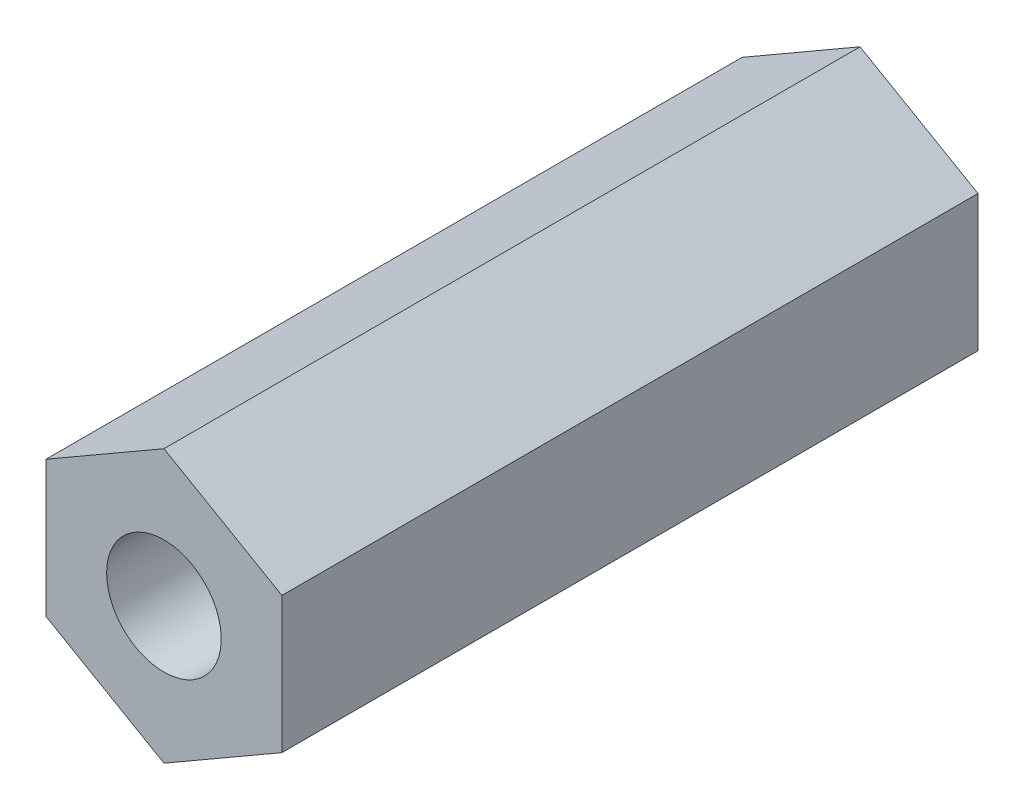
ISO-10303-21;
HEADER;
FILE_DESCRIPTION(('STEP AP214'),'2;1');
FILE_NAME('part.step','',(''),(''),'','','');
FILE_SCHEMA(('AUTOMOTIVE_DESIGN { 1 0 10303 214 1 1 1 1 }'));
ENDSEC;
DATA;
#1=APPLICATION_CONTEXT('core data for automotive mechanical design processes');
#2=APPLICATION_PROTOCOL_DEFINITION('international standard','automotive_design',2000,#1);
#3=PRODUCT_CONTEXT('',#1,'mechanical');
#4=PRODUCT('Part','Part','',(#3));
#5=PRODUCT_RELATED_PRODUCT_CATEGORY('part','',(#4));
#6=PRODUCT_DEFINITION_FORMATION('','',#4);
#7=PRODUCT_DEFINITION_CONTEXT('part definition',#1,'design');
#8=PRODUCT_DEFINITION('design','',#6,#7);
#9=PRODUCT_DEFINITION_SHAPE('','',#8);
#10=(LENGTH_UNIT() NAMED_UNIT(*) SI_UNIT(.MILLI.,.METRE.));
#11=(NAMED_UNIT(*) PLANE_ANGLE_UNIT() SI_UNIT($,.RADIAN.));
#12=(NAMED_UNIT(*) SI_UNIT($,.STERADIAN.) SOLID_ANGLE_UNIT());
#13=UNCERTAINTY_MEASURE_WITH_UNIT(LENGTH_MEASURE(1.E-05),#10,'distance_accuracy_value','');
#14=(GEOMETRIC_REPRESENTATION_CONTEXT(3) GLOBAL_UNCERTAINTY_ASSIGNED_CONTEXT((#13)) GLOBAL_UNIT_ASSIGNED_CONTEXT((#10,
#11,#12)) REPRESENTATION_CONTEXT('',''));
#15=CARTESIAN_POINT('',(0.,0.,0.));
#16=DIRECTION('',(0.,0.,1.));
#17=DIRECTION('',(1.,0.,0.));
#18=AXIS2_PLACEMENT_3D('',#15,#16,#17);
#19=CARTESIAN_POINT('',(39.4987426312891,33.98,63.5));
#20=DIRECTION('',(-1.,0.,0.));
#21=DIRECTION('',(0.,0.,1.));
#22=AXIS2_PLACEMENT_3D('',#19,#20,#21);
#23=PLANE('',#22);
#24=DIRECTION('',(0.,1.,0.));
#25=VECTOR('',#24,1.);
#26=CARTESIAN_POINT('',(39.4987426312891,33.98,42.85));
#27=LINE('',#26,#25);
#28=CARTESIAN_POINT('',(39.4987426312891,33.98,42.85));
#29=VERTEX_POINT('',#28);
#30=CARTESIAN_POINT('',(39.4987426312891,38.02,42.85));
#31=VERTEX_POINT('',#30);
#32=EDGE_CURVE('E135',#29,#31,#27,.T.);
#33=ORIENTED_EDGE('',*,*,#32,.T.);
#34=DIRECTION('',(0.,0.,-1.));
#35=VECTOR('',#34,1.);
#36=CARTESIAN_POINT('',(39.4987426312891,38.02,63.5));
#37=LINE('',#36,#35);
#38=CARTESIAN_POINT('',(39.4987426312891,38.02,63.5));
#39=VERTEX_POINT('',#38);
#40=EDGE_CURVE('E11',#39,#31,#37,.T.);
#41=ORIENTED_EDGE('',*,*,#40,.F.);
#42=DIRECTION('',(0.,1.,0.));
#43=VECTOR('',#42,1.);
#44=CARTESIAN_POINT('',(39.4987426312891,33.98,63.5));
#45=LINE('',#44,#43);
#46=CARTESIAN_POINT('',(39.4987426312891,33.98,63.5));
#47=VERTEX_POINT('',#46);
#48=EDGE_CURVE('E151',#47,#39,#45,.T.);
#49=ORIENTED_EDGE('',*,*,#48,.F.);
#50=DIRECTION('',(0.,0.,-1.));
#51=VECTOR('',#50,1.);
#52=CARTESIAN_POINT('',(39.4987426312891,33.98,63.5));
#53=LINE('',#52,#51);
#54=EDGE_CURVE('E128',#47,#29,#53,.T.);
#55=ORIENTED_EDGE('',*,*,#54,.T.);
#56=EDGE_LOOP('',(#33,#41,#49,#55));
#57=FACE_BOUND('',#56,.T.);
#58=ADVANCED_FACE('F44',(#57),#23,.F.);
#59=CARTESIAN_POINT('',(39.4987426312891,38.02,63.5));
#60=DIRECTION('',(-0.5,-0.866025403784438,0.));
#61=DIRECTION('',(0.866025403784439,-0.5,0.));
#62=AXIS2_PLACEMENT_3D('',#59,#60,#61);
#63=PLANE('',#62);
#64=DIRECTION('',(-0.866025403784439,0.5,0.));
#65=VECTOR('',#64,1.);
#66=CARTESIAN_POINT('',(39.4987426312891,38.02,42.85));
#67=LINE('',#66,#65);
#68=CARTESIAN_POINT('',(36.,40.04,42.85));
#69=VERTEX_POINT('',#68);
#70=EDGE_CURVE('E136',#31,#69,#67,.T.);
#71=ORIENTED_EDGE('',*,*,#70,.T.);
#72=DIRECTION('',(0.,0.,-1.));
#73=VECTOR('',#72,1.);
#74=CARTESIAN_POINT('',(36.,40.04,63.5));
#75=LINE('',#74,#73);
#76=CARTESIAN_POINT('',(36.,40.04,63.5));
#77=VERTEX_POINT('',#76);
#78=EDGE_CURVE('E53',#77,#69,#75,.T.);
#79=ORIENTED_EDGE('',*,*,#78,.F.);
#80=DIRECTION('',(-0.866025403784439,0.5,0.));
#81=VECTOR('',#80,1.);
#82=CARTESIAN_POINT('',(39.4987426312891,38.02,63.5));
#83=LINE('',#82,#81);
#84=EDGE_CURVE('E97',#39,#77,#83,.T.);
#85=ORIENTED_EDGE('',*,*,#84,.F.);
#86=ORIENTED_EDGE('',*,*,#40,.T.);
#87=EDGE_LOOP('',(#71,#79,#85,#86));
#88=FACE_BOUND('',#87,.T.);
#89=ADVANCED_FACE('F177',(#88),#63,.F.);
#90=CARTESIAN_POINT('',(36.,40.04,63.5));
#91=DIRECTION('',(0.5,-0.866025403784439,0.));
#92=DIRECTION('',(0.866025403784439,0.5,0.));
#93=AXIS2_PLACEMENT_3D('',#90,#91,#92);
#94=PLANE('',#93);
#95=DIRECTION('',(-0.866025403784439,-0.5,0.));
#96=VECTOR('',#95,1.);
#97=CARTESIAN_POINT('',(36.,40.04,42.85));
#98=LINE('',#97,#96);
#99=CARTESIAN_POINT('',(32.5012573687109,38.02,42.85));
#100=VERTEX_POINT('',#99);
#101=EDGE_CURVE('E142',#69,#100,#98,.T.);
#102=ORIENTED_EDGE('',*,*,#101,.T.);
#103=DIRECTION('',(0.,0.,-1.));
#104=VECTOR('',#103,1.);
#105=CARTESIAN_POINT('',(32.5012573687109,38.02,63.5));
#106=LINE('',#105,#104);
#107=CARTESIAN_POINT('',(32.5012573687109,38.02,63.5));
#108=VERTEX_POINT('',#107);
#109=EDGE_CURVE('E121',#108,#100,#106,.T.);
#110=ORIENTED_EDGE('',*,*,#109,.F.);
#111=DIRECTION('',(-0.866025403784439,-0.5,0.));
#112=VECTOR('',#111,1.);
#113=CARTESIAN_POINT('',(36.,40.04,63.5));
#114=LINE('',#113,#112);
#115=EDGE_CURVE('E115',#77,#108,#114,.T.);
#116=ORIENTED_EDGE('',*,*,#115,.F.);
#117=ORIENTED_EDGE('',*,*,#78,.T.);
#118=EDGE_LOOP('',(#102,#110,#116,#117));
#119=FACE_BOUND('',#118,.T.);
#120=ADVANCED_FACE('F161',(#119),#94,.F.);
#121=CARTESIAN_POINT('',(32.5012573687109,38.02,63.5));
#122=DIRECTION('',(1.,0.,0.));
#123=DIRECTION('',(0.,0.,-1.));
#124=AXIS2_PLACEMENT_3D('',#121,#122,#123);
#125=PLANE('',#124);
#126=DIRECTION('',(0.,-1.,0.));
#127=VECTOR('',#126,1.);
#128=CARTESIAN_POINT('',(32.5012573687109,38.02,42.85));
#129=LINE('',#128,#127);
#130=CARTESIAN_POINT('',(32.5012573687109,33.98,42.85));
#131=VERTEX_POINT('',#130);
#132=EDGE_CURVE('E123',#100,#131,#129,.T.);
#133=ORIENTED_EDGE('',*,*,#132,.T.);
#134=DIRECTION('',(0.,0.,-1.));
#135=VECTOR('',#134,1.);
#136=CARTESIAN_POINT('',(32.5012573687109,33.98,63.5));
#137=LINE('',#136,#135);
#138=CARTESIAN_POINT('',(32.5012573687109,33.98,63.5));
#139=VERTEX_POINT('',#138);
#140=EDGE_CURVE('E117',#139,#131,#137,.T.);
#141=ORIENTED_EDGE('',*,*,#140,.F.);
#142=DIRECTION('',(0.,-1.,0.));
#143=VECTOR('',#142,1.);
#144=CARTESIAN_POINT('',(32.5012573687109,38.02,63.5));
#145=LINE('',#144,#143);
#146=EDGE_CURVE('E106',#108,#139,#145,.T.);
#147=ORIENTED_EDGE('',*,*,#146,.F.);
#148=ORIENTED_EDGE('',*,*,#109,.T.);
#149=EDGE_LOOP('',(#133,#141,#147,#148));
#150=FACE_BOUND('',#149,.T.);
#151=ADVANCED_FACE('F120',(#150),#125,.F.);
#152=CARTESIAN_POINT('',(32.5012573687109,33.98,63.5));
#153=DIRECTION('',(0.499999999999998,0.86602540378444,0.));
#154=DIRECTION('',(-0.86602540378444,0.499999999999998,0.));
#155=AXIS2_PLACEMENT_3D('',#152,#153,#154);
#156=PLANE('',#155);
#157=DIRECTION('',(0.86602540378444,-0.499999999999998,0.));
#158=VECTOR('',#157,1.);
#159=CARTESIAN_POINT('',(32.5012573687109,33.98,42.85));
#160=LINE('',#159,#158);
#161=CARTESIAN_POINT('',(36.,31.96,42.85));
#162=VERTEX_POINT('',#161);
#163=EDGE_CURVE('E82',#131,#162,#160,.T.);
#164=ORIENTED_EDGE('',*,*,#163,.T.);
#165=DIRECTION('',(0.,0.,-1.));
#166=VECTOR('',#165,1.);
#167=CARTESIAN_POINT('',(36.,31.96,63.5));
#168=LINE('',#167,#166);
#169=CARTESIAN_POINT('',(36.,31.96,63.5));
#170=VERTEX_POINT('',#169);
#171=EDGE_CURVE('E124',#170,#162,#168,.T.);
#172=ORIENTED_EDGE('',*,*,#171,.F.);
#173=DIRECTION('',(0.86602540378444,-0.499999999999998,0.));
#174=VECTOR('',#173,1.);
#175=CARTESIAN_POINT('',(32.5012573687109,33.98,63.5));
#176=LINE('',#175,#174);
#177=EDGE_CURVE('E109',#139,#170,#176,.T.);
#178=ORIENTED_EDGE('',*,*,#177,.F.);
#179=ORIENTED_EDGE('',*,*,#140,.T.);
#180=EDGE_LOOP('',(#164,#172,#178,#179));
#181=FACE_BOUND('',#180,.T.);
#182=ADVANCED_FACE('F127',(#181),#156,.F.);
#183=CARTESIAN_POINT('',(36.,31.96,63.5));
#184=DIRECTION('',(-0.499999999999999,0.866025403784439,0.));
#185=DIRECTION('',(-0.866025403784439,-0.499999999999999,0.));
#186=AXIS2_PLACEMENT_3D('',#183,#184,#185);
#187=PLANE('',#186);
#188=DIRECTION('',(0.866025403784439,0.499999999999999,0.));
#189=VECTOR('',#188,1.);
#190=CARTESIAN_POINT('',(36.,31.96,42.85));
#191=LINE('',#190,#189);
#192=EDGE_CURVE('E93',#162,#29,#191,.T.);
#193=ORIENTED_EDGE('',*,*,#192,.T.);
#194=ORIENTED_EDGE('',*,*,#54,.F.);
#195=DIRECTION('',(0.866025403784439,0.499999999999999,0.));
#196=VECTOR('',#195,1.);
#197=CARTESIAN_POINT('',(36.,31.96,63.5));
#198=LINE('',#197,#196);
#199=EDGE_CURVE('E64',#170,#47,#198,.T.);
#200=ORIENTED_EDGE('',*,*,#199,.F.);
#201=ORIENTED_EDGE('',*,*,#171,.T.);
#202=EDGE_LOOP('',(#193,#194,#200,#201));
#203=FACE_BOUND('',#202,.T.);
#204=ADVANCED_FACE('F169',(#203),#187,.F.);
#205=CARTESIAN_POINT('',(0.,0.,63.5));
#206=DIRECTION('',(0.,0.,1.));
#207=DIRECTION('',(1.,0.,0.));
#208=AXIS2_PLACEMENT_3D('',#205,#206,#207);
#209=PLANE('',#208);
#210=CARTESIAN_POINT('',(36.,36.,63.5));
#211=DIRECTION('',(0.,0.,1.));
#212=DIRECTION('',(1.,0.,0.));
#213=AXIS2_PLACEMENT_3D('',#210,#211,#212);
#214=CIRCLE('',#213,1.7);
#215=CARTESIAN_POINT('',(34.3,36.,63.5));
#216=VERTEX_POINT('',#215);
#217=EDGE_CURVE('E139',#216,#216,#214,.T.);
#218=ORIENTED_EDGE('',*,*,#217,.F.);
#219=EDGE_LOOP('',(#218));
#220=FACE_BOUND('',#219,.T.);
#221=ORIENTED_EDGE('',*,*,#48,.T.);
#222=ORIENTED_EDGE('',*,*,#84,.T.);
#223=ORIENTED_EDGE('',*,*,#115,.T.);
#224=ORIENTED_EDGE('',*,*,#146,.T.);
#225=ORIENTED_EDGE('',*,*,#177,.T.);
#226=ORIENTED_EDGE('',*,*,#199,.T.);
#227=EDGE_LOOP('',(#221,#222,#223,#224,#225,#226));
#228=FACE_BOUND('',#227,.T.);
#229=ADVANCED_FACE('F107',(#220,#228),#209,.T.);
#230=CARTESIAN_POINT('',(0.,0.,42.85));
#231=DIRECTION('',(0.,0.,1.));
#232=DIRECTION('',(1.,0.,0.));
#233=AXIS2_PLACEMENT_3D('',#230,#231,#232);
#234=PLANE('',#233);
#235=CARTESIAN_POINT('',(36.,36.,42.85));
#236=DIRECTION('',(0.,0.,1.));
#237=DIRECTION('',(1.,0.,0.));
#238=AXIS2_PLACEMENT_3D('',#235,#236,#237);
#239=CIRCLE('',#238,1.7);
#240=CARTESIAN_POINT('',(34.3,36.,42.85));
#241=VERTEX_POINT('',#240);
#242=EDGE_CURVE('E237',#241,#241,#239,.T.);
#243=ORIENTED_EDGE('',*,*,#242,.T.);
#244=EDGE_LOOP('',(#243));
#245=FACE_BOUND('',#244,.T.);
#246=ORIENTED_EDGE('',*,*,#32,.F.);
#247=ORIENTED_EDGE('',*,*,#192,.F.);
#248=ORIENTED_EDGE('',*,*,#163,.F.);
#249=ORIENTED_EDGE('',*,*,#132,.F.);
#250=ORIENTED_EDGE('',*,*,#101,.F.);
#251=ORIENTED_EDGE('',*,*,#70,.F.);
#252=EDGE_LOOP('',(#246,#247,#248,#249,#250,#251));
#253=FACE_BOUND('',#252,.T.);
#254=ADVANCED_FACE('F163',(#245,#253),#234,.F.);
#255=CARTESIAN_POINT('',(36.,36.,63.5));
#256=DIRECTION('',(0.,0.,-1.));
#257=DIRECTION('',(-1.,0.,0.));
#258=AXIS2_PLACEMENT_3D('',#255,#256,#257);
#259=CYLINDRICAL_SURFACE('',#258,1.7);
#260=CARTESIAN_POINT('',(34.3,36.,63.5));
#261=CARTESIAN_POINT('',(34.3,36.,63.2848958333333));
#262=CARTESIAN_POINT('',(34.3,36.,63.0697916666667));
#263=CARTESIAN_POINT('',(34.3,36.,62.6395833333333));
#264=CARTESIAN_POINT('',(34.3,36.,62.4244791666667));
#265=CARTESIAN_POINT('',(34.3,36.,61.9942708333333));
#266=CARTESIAN_POINT('',(34.3,36.,61.7791666666667));
#267=CARTESIAN_POINT('',(34.3,36.,61.3489583333333));
#268=CARTESIAN_POINT('',(34.3,36.,61.1338541666667));
#269=CARTESIAN_POINT('',(34.3,36.,60.7036458333333));
#270=CARTESIAN_POINT('',(34.3,36.,60.4885416666667));
#271=CARTESIAN_POINT('',(34.3,36.,60.0583333333333));
#272=CARTESIAN_POINT('',(34.3,36.,59.8432291666667));
#273=CARTESIAN_POINT('',(34.3,36.,59.4130208333333));
#274=CARTESIAN_POINT('',(34.3,36.,59.1979166666667));
#275=CARTESIAN_POINT('',(34.3,36.,58.7677083333333));
#276=CARTESIAN_POINT('',(34.3,36.,58.5526041666667));
#277=CARTESIAN_POINT('',(34.3,36.,58.1223958333333));
#278=CARTESIAN_POINT('',(34.3,36.,57.9072916666667));
#279=CARTESIAN_POINT('',(34.3,36.,57.4770833333333));
#280=CARTESIAN_POINT('',(34.3,36.,57.2619791666667));
#281=CARTESIAN_POINT('',(34.3,36.,56.8317708333333));
#282=CARTESIAN_POINT('',(34.3,36.,56.6166666666667));
#283=CARTESIAN_POINT('',(34.3,36.,56.1864583333333));
#284=CARTESIAN_POINT('',(34.3,36.,55.9713541666667));
#285=CARTESIAN_POINT('',(34.3,36.,55.5411458333333));
#286=CARTESIAN_POINT('',(34.3,36.,55.3260416666667));
#287=CARTESIAN_POINT('',(34.3,36.,54.8958333333333));
#288=CARTESIAN_POINT('',(34.3,36.,54.6807291666667));
#289=CARTESIAN_POINT('',(34.3,36.,54.2505208333333));
#290=CARTESIAN_POINT('',(34.3,36.,54.0354166666667));
#291=CARTESIAN_POINT('',(34.3,36.,53.6052083333333));
#292=CARTESIAN_POINT('',(34.3,36.,53.3901041666667));
#293=CARTESIAN_POINT('',(34.3,36.,52.9598958333333));
#294=CARTESIAN_POINT('',(34.3,36.,52.7447916666667));
#295=CARTESIAN_POINT('',(34.3,36.,52.3145833333333));
#296=CARTESIAN_POINT('',(34.3,36.,52.0994791666667));
#297=CARTESIAN_POINT('',(34.3,36.,51.6692708333333));
#298=CARTESIAN_POINT('',(34.3,36.,51.4541666666667));
#299=CARTESIAN_POINT('',(34.3,36.,51.0239583333333));
#300=CARTESIAN_POINT('',(34.3,36.,50.8088541666667));
#301=CARTESIAN_POINT('',(34.3,36.,50.3786458333333));
#302=CARTESIAN_POINT('',(34.3,36.,50.1635416666667));
#303=CARTESIAN_POINT('',(34.3,36.,49.7333333333333));
#304=CARTESIAN_POINT('',(34.3,36.,49.5182291666667));
#305=CARTESIAN_POINT('',(34.3,36.,49.0880208333333));
#306=CARTESIAN_POINT('',(34.3,36.,48.8729166666667));
#307=CARTESIAN_POINT('',(34.3,36.,48.4427083333333));
#308=CARTESIAN_POINT('',(34.3,36.,48.2276041666667));
#309=CARTESIAN_POINT('',(34.3,36.,47.7973958333333));
#310=CARTESIAN_POINT('',(34.3,36.,47.5822916666667));
#311=CARTESIAN_POINT('',(34.3,36.,47.1520833333333));
#312=CARTESIAN_POINT('',(34.3,36.,46.9369791666667));
#313=CARTESIAN_POINT('',(34.3,36.,46.5067708333333));
#314=CARTESIAN_POINT('',(34.3,36.,46.2916666666667));
#315=CARTESIAN_POINT('',(34.3,36.,45.8614583333333));
#316=CARTESIAN_POINT('',(34.3,36.,45.6463541666667));
#317=CARTESIAN_POINT('',(34.3,36.,45.2161458333333));
#318=CARTESIAN_POINT('',(34.3,36.,45.0010416666667));
#319=CARTESIAN_POINT('',(34.3,36.,44.5708333333333));
#320=CARTESIAN_POINT('',(34.3,36.,44.3557291666667));
#321=CARTESIAN_POINT('',(34.3,36.,43.9255208333333));
#322=CARTESIAN_POINT('',(34.3,36.,43.7104166666667));
#323=CARTESIAN_POINT('',(34.3,36.,43.2802083333333));
#324=CARTESIAN_POINT('',(34.3,36.,43.0651041666667));
#325=CARTESIAN_POINT('',(34.3,36.,42.85));
#326=B_SPLINE_CURVE_WITH_KNOTS('',3,(#260,#261,#262,#263,#264,#265,#266,#267,#268,#269,#270,
#271,#272,#273,#274,#275,#276,#277,#278,#279,#280,#281,#282,#283,#284,#285,#286,#287,#288,#289,
#290,#291,#292,#293,#294,#295,#296,#297,#298,#299,#300,#301,#302,#303,#304,#305,#306,#307,#308,
#309,#310,#311,#312,#313,#314,#315,#316,#317,#318,#319,#320,#321,#322,#323,#324,#325),
.UNSPECIFIED.,.F.,.F.,(4,2,2,2,2,2,2,2,2,2,2,2,2,2,2,2,2,2,2,2,2,2,2,2,2,2,2,2,2,2,2,2,4),(0.,
0.645312500000009,1.290625,1.93593750000001,2.58125000000001,3.22656250000001,3.871875,
4.51718750000001,5.16250000000001,5.80781250000001,6.453125,7.09843750000001,7.74375000000001,
8.3890625,9.034375,9.67968750000001,10.325,10.9703125,11.615625,12.2609375,12.90625,13.5515625,
14.196875,14.8421875,15.4875,16.1328125,16.778125,17.4234375,18.06875,18.7140625,19.359375,
20.0046875,20.65),.UNSPECIFIED.);
#327=EDGE_CURVE('BSEAM218',#216,#241,#326,.T.);
#328=ORIENTED_EDGE('',*,*,#217,.T.);
#329=ORIENTED_EDGE('',*,*,#242,.F.);
#330=ORIENTED_EDGE('',*,*,#327,.T.);
#331=ORIENTED_EDGE('',*,*,#327,.F.);
#332=EDGE_LOOP('',(#328,#330,#329,#331));
#333=FACE_BOUND('',#332,.T.);
#334=ADVANCED_FACE('F218',(#333),#259,.F.);
#335=CLOSED_SHELL('',(#58,#89,#120,#151,#182,#204,#229,#254,#334));
#336=MANIFOLD_SOLID_BREP('B2',#335);
#337=ADVANCED_BREP_SHAPE_REPRESENTATION('',(#18,#336),#14);
#338=SHAPE_DEFINITION_REPRESENTATION(#9,#337);
ENDSEC;
END-ISO-10303-21;
